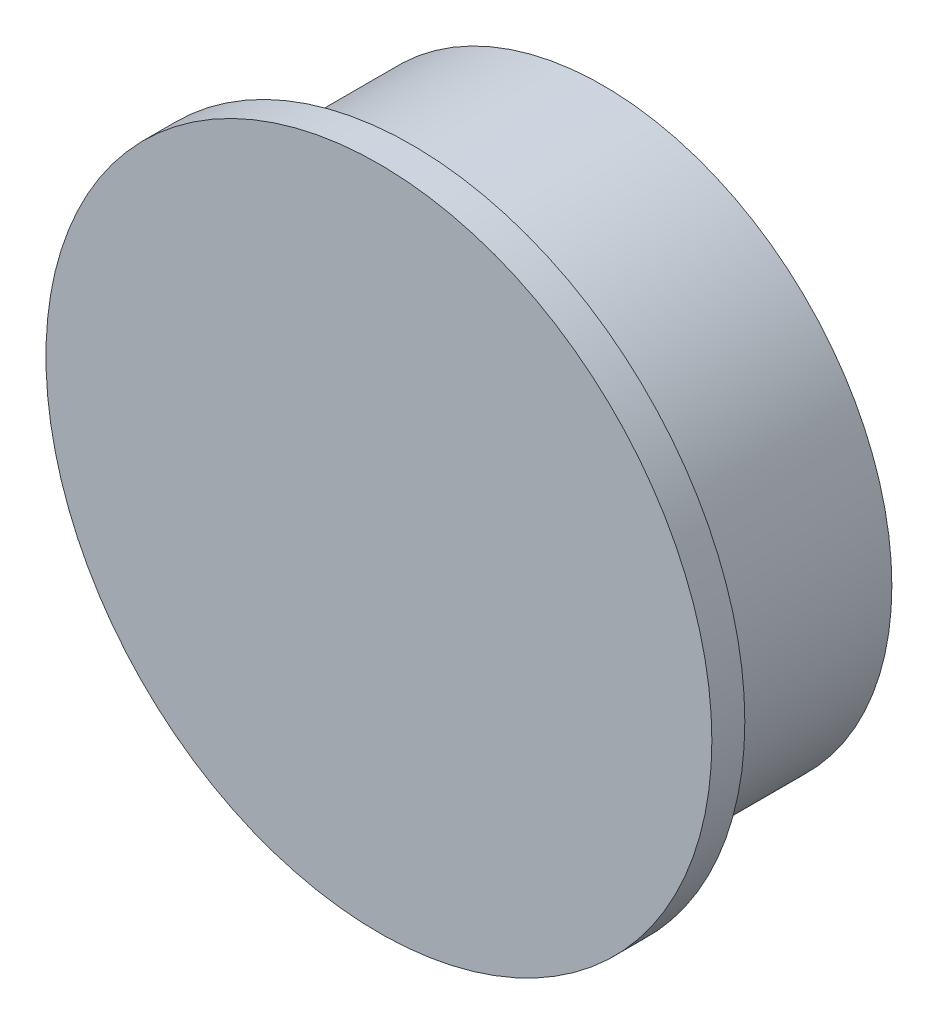
ISO-10303-21;
HEADER;
FILE_DESCRIPTION(('STEP AP214'),'2;1');
FILE_NAME('part.step','',(''),(''),'','','');
FILE_SCHEMA(('AUTOMOTIVE_DESIGN { 1 0 10303 214 1 1 1 1 }'));
ENDSEC;
DATA;
#1=APPLICATION_CONTEXT('core data for automotive mechanical design processes');
#2=APPLICATION_PROTOCOL_DEFINITION('international standard','automotive_design',2000,#1);
#3=PRODUCT_CONTEXT('',#1,'mechanical');
#4=PRODUCT('Part','Part','',(#3));
#5=PRODUCT_RELATED_PRODUCT_CATEGORY('part','',(#4));
#6=PRODUCT_DEFINITION_FORMATION('','',#4);
#7=PRODUCT_DEFINITION_CONTEXT('part definition',#1,'design');
#8=PRODUCT_DEFINITION('design','',#6,#7);
#9=PRODUCT_DEFINITION_SHAPE('','',#8);
#10=(LENGTH_UNIT() NAMED_UNIT(*) SI_UNIT(.MILLI.,.METRE.));
#11=(NAMED_UNIT(*) PLANE_ANGLE_UNIT() SI_UNIT($,.RADIAN.));
#12=(NAMED_UNIT(*) SI_UNIT($,.STERADIAN.) SOLID_ANGLE_UNIT());
#13=UNCERTAINTY_MEASURE_WITH_UNIT(LENGTH_MEASURE(1.E-05),#10,'distance_accuracy_value','');
#14=(GEOMETRIC_REPRESENTATION_CONTEXT(3) GLOBAL_UNCERTAINTY_ASSIGNED_CONTEXT((#13)) GLOBAL_UNIT_ASSIGNED_CONTEXT((#10,
#11,#12)) REPRESENTATION_CONTEXT('',''));
#15=CARTESIAN_POINT('',(0.,0.,0.));
#16=DIRECTION('',(0.,0.,1.));
#17=DIRECTION('',(1.,0.,0.));
#18=AXIS2_PLACEMENT_3D('',#15,#16,#17);
#19=CARTESIAN_POINT('',(34.6978046051641,180.41411157146,20.18));
#20=DIRECTION('',(0.,0.,-1.));
#21=DIRECTION('',(-1.,0.,0.));
#22=AXIS2_PLACEMENT_3D('',#19,#20,#21);
#23=CYLINDRICAL_SURFACE('',#22,30.5);
#24=CARTESIAN_POINT('',(34.6978046051641,180.41411157146,20.18));
#25=DIRECTION('',(0.,0.,1.));
#26=DIRECTION('',(1.,0.,0.));
#27=AXIS2_PLACEMENT_3D('',#24,#25,#26);
#28=CIRCLE('',#27,30.5);
#29=CARTESIAN_POINT('',(65.1978046051641,180.41411157146,20.18));
#30=VERTEX_POINT('',#29);
#31=EDGE_CURVE('E10',#30,#30,#28,.T.);
#32=ORIENTED_EDGE('',*,*,#31,.F.);
#33=EDGE_LOOP('',(#32));
#34=FACE_BOUND('',#33,.T.);
#35=CARTESIAN_POINT('',(34.6978046051641,180.41411157146,0.));
#36=DIRECTION('',(0.,0.,1.));
#37=DIRECTION('',(1.,0.,0.));
#38=AXIS2_PLACEMENT_3D('',#35,#36,#37);
#39=CIRCLE('',#38,30.5);
#40=CARTESIAN_POINT('',(65.1978046051641,180.41411157146,0.));
#41=VERTEX_POINT('',#40);
#42=EDGE_CURVE('E38',#41,#41,#39,.T.);
#43=ORIENTED_EDGE('',*,*,#42,.T.);
#44=EDGE_LOOP('',(#43));
#45=FACE_BOUND('',#44,.T.);
#46=ADVANCED_FACE('F35',(#34,#45),#23,.T.);
#47=CARTESIAN_POINT('',(34.6978046051641,180.41411157146,0.));
#48=DIRECTION('',(0.,0.,1.));
#49=DIRECTION('',(1.,0.,0.));
#50=AXIS2_PLACEMENT_3D('',#47,#48,#49);
#51=PLANE('',#50);
#52=ORIENTED_EDGE('',*,*,#42,.F.);
#53=EDGE_LOOP('',(#52));
#54=FACE_BOUND('',#53,.T.);
#55=ADVANCED_FACE('F58',(#54),#51,.F.);
#56=CARTESIAN_POINT('',(34.6978046051641,180.41411157146,23.66));
#57=DIRECTION('',(0.,0.,-1.));
#58=DIRECTION('',(-1.,0.,0.));
#59=AXIS2_PLACEMENT_3D('',#56,#57,#58);
#60=CYLINDRICAL_SURFACE('',#59,35.155);
#61=CARTESIAN_POINT('',(34.6978046051641,180.41411157146,23.66));
#62=DIRECTION('',(0.,0.,1.));
#63=DIRECTION('',(1.,0.,0.));
#64=AXIS2_PLACEMENT_3D('',#61,#62,#63);
#65=CIRCLE('',#64,35.155);
#66=CARTESIAN_POINT('',(69.8528046051641,180.41411157146,23.66));
#67=VERTEX_POINT('',#66);
#68=EDGE_CURVE('E45',#67,#67,#65,.T.);
#69=ORIENTED_EDGE('',*,*,#68,.F.);
#70=EDGE_LOOP('',(#69));
#71=FACE_BOUND('',#70,.T.);
#72=CARTESIAN_POINT('',(34.6978046051641,180.41411157146,20.18));
#73=DIRECTION('',(0.,0.,1.));
#74=DIRECTION('',(1.,0.,0.));
#75=AXIS2_PLACEMENT_3D('',#72,#73,#74);
#76=CIRCLE('',#75,35.155);
#77=CARTESIAN_POINT('',(69.8528046051641,180.41411157146,20.18));
#78=VERTEX_POINT('',#77);
#79=EDGE_CURVE('E47',#78,#78,#76,.T.);
#80=ORIENTED_EDGE('',*,*,#79,.T.);
#81=EDGE_LOOP('',(#80));
#82=FACE_BOUND('',#81,.T.);
#83=ADVANCED_FACE('F55',(#71,#82),#60,.T.);
#84=CARTESIAN_POINT('',(34.6978046051641,180.41411157146,23.66));
#85=DIRECTION('',(0.,0.,1.));
#86=DIRECTION('',(1.,0.,0.));
#87=AXIS2_PLACEMENT_3D('',#84,#85,#86);
#88=PLANE('',#87);
#89=ORIENTED_EDGE('',*,*,#68,.T.);
#90=EDGE_LOOP('',(#89));
#91=FACE_BOUND('',#90,.T.);
#92=ADVANCED_FACE('F53',(#91),#88,.T.);
#93=CARTESIAN_POINT('',(34.6978046051641,180.41411157146,20.18));
#94=DIRECTION('',(0.,0.,1.));
#95=DIRECTION('',(1.,0.,0.));
#96=AXIS2_PLACEMENT_3D('',#93,#94,#95);
#97=PLANE('',#96);
#98=ORIENTED_EDGE('',*,*,#31,.T.);
#99=EDGE_LOOP('',(#98));
#100=FACE_BOUND('',#99,.T.);
#101=ORIENTED_EDGE('',*,*,#79,.F.);
#102=EDGE_LOOP('',(#101));
#103=FACE_BOUND('',#102,.T.);
#104=ADVANCED_FACE('F62',(#100,#103),#97,.F.);
#105=CLOSED_SHELL('',(#46,#55,#83,#92,#104));
#106=MANIFOLD_SOLID_BREP('B2',#105);
#107=ADVANCED_BREP_SHAPE_REPRESENTATION('',(#18,#106),#14);
#108=SHAPE_DEFINITION_REPRESENTATION(#9,#107);
ENDSEC;
END-ISO-10303-21;
